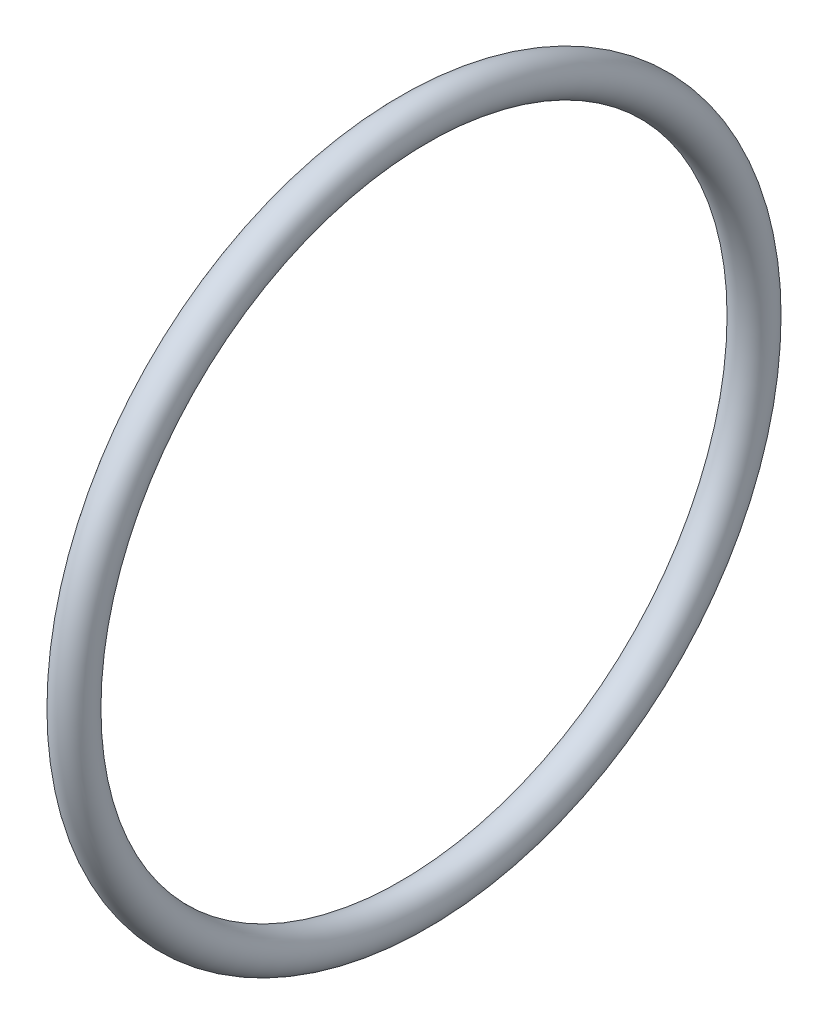
ISO-10303-21;
HEADER;
FILE_DESCRIPTION(('STEP AP214'),'2;1');
FILE_NAME('part.step','',(''),(''),'','','');
FILE_SCHEMA(('AUTOMOTIVE_DESIGN { 1 0 10303 214 1 1 1 1 }'));
ENDSEC;
DATA;
#1=APPLICATION_CONTEXT('core data for automotive mechanical design processes');
#2=APPLICATION_PROTOCOL_DEFINITION('international standard','automotive_design',2000,#1);
#3=PRODUCT_CONTEXT('',#1,'mechanical');
#4=PRODUCT('Part','Part','',(#3));
#5=PRODUCT_RELATED_PRODUCT_CATEGORY('part','',(#4));
#6=PRODUCT_DEFINITION_FORMATION('','',#4);
#7=PRODUCT_DEFINITION_CONTEXT('part definition',#1,'design');
#8=PRODUCT_DEFINITION('design','',#6,#7);
#9=PRODUCT_DEFINITION_SHAPE('','',#8);
#10=(LENGTH_UNIT() NAMED_UNIT(*) SI_UNIT(.MILLI.,.METRE.));
#11=(NAMED_UNIT(*) PLANE_ANGLE_UNIT() SI_UNIT($,.RADIAN.));
#12=(NAMED_UNIT(*) SI_UNIT($,.STERADIAN.) SOLID_ANGLE_UNIT());
#13=UNCERTAINTY_MEASURE_WITH_UNIT(LENGTH_MEASURE(1.E-05),#10,'distance_accuracy_value','');
#14=(GEOMETRIC_REPRESENTATION_CONTEXT(3) GLOBAL_UNCERTAINTY_ASSIGNED_CONTEXT((#13)) GLOBAL_UNIT_ASSIGNED_CONTEXT((#10,
#11,#12)) REPRESENTATION_CONTEXT('',''));
#15=CARTESIAN_POINT('',(0.,0.,0.));
#16=DIRECTION('',(0.,0.,1.));
#17=DIRECTION('',(1.,0.,0.));
#18=AXIS2_PLACEMENT_3D('',#15,#16,#17);
#19=CARTESIAN_POINT('',(0.,0.,0.));
#20=DIRECTION('',(-1.,0.,0.));
#21=DIRECTION('',(0.,0.,1.));
#22=AXIS2_PLACEMENT_3D('',#19,#20,#21);
#23=TOROIDAL_SURFACE('',#22,28.2575,1.5875);
#24=CARTESIAN_POINT('',(0.,0.,29.845));
#25=VERTEX_POINT('',#24);
#26=VERTEX_LOOP('',#25);
#27=FACE_BOUND('',#26,.T.);
#28=ADVANCED_FACE('F39',(#27),#23,.T.);
#29=CLOSED_SHELL('',(#28));
#30=MANIFOLD_SOLID_BREP('B2',#29);
#31=ADVANCED_BREP_SHAPE_REPRESENTATION('',(#18,#30),#14);
#32=SHAPE_DEFINITION_REPRESENTATION(#9,#31);
ENDSEC;
END-ISO-10303-21;
